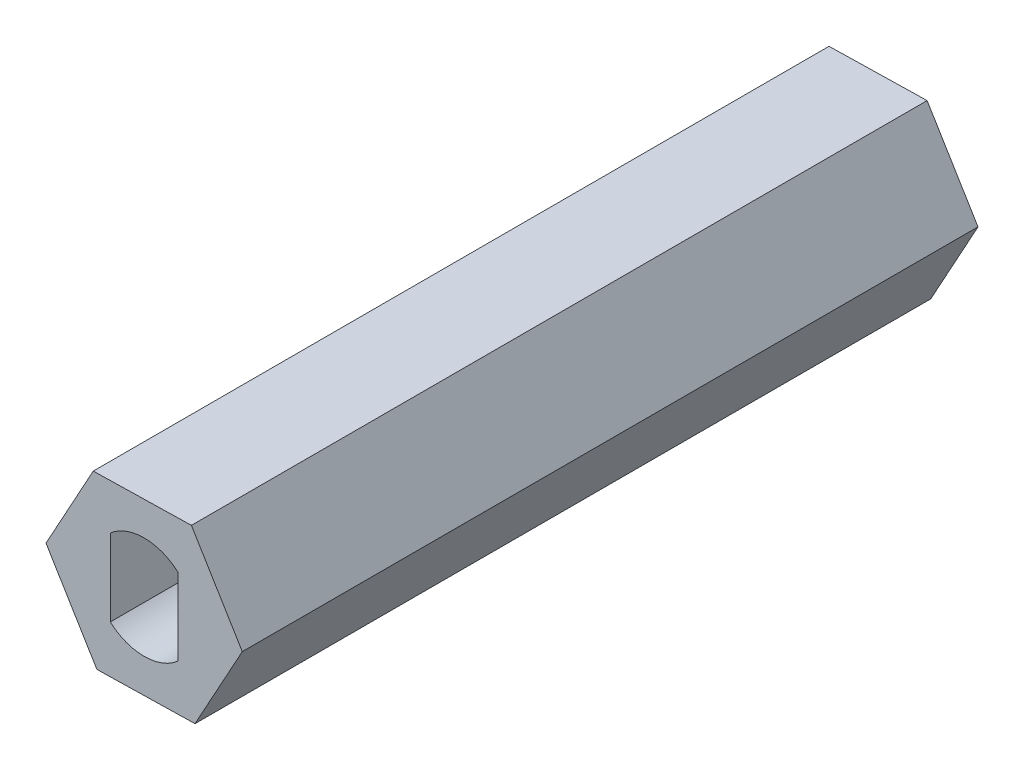
ISO-10303-21;
HEADER;
FILE_DESCRIPTION(('STEP AP214'),'2;1');
FILE_NAME('part.step','',(''),(''),'','','');
FILE_SCHEMA(('AUTOMOTIVE_DESIGN { 1 0 10303 214 1 1 1 1 }'));
ENDSEC;
DATA;
#1=APPLICATION_CONTEXT('core data for automotive mechanical design processes');
#2=APPLICATION_PROTOCOL_DEFINITION('international standard','automotive_design',2000,#1);
#3=PRODUCT_CONTEXT('',#1,'mechanical');
#4=PRODUCT('Part','Part','',(#3));
#5=PRODUCT_RELATED_PRODUCT_CATEGORY('part','',(#4));
#6=PRODUCT_DEFINITION_FORMATION('','',#4);
#7=PRODUCT_DEFINITION_CONTEXT('part definition',#1,'design');
#8=PRODUCT_DEFINITION('design','',#6,#7);
#9=PRODUCT_DEFINITION_SHAPE('','',#8);
#10=(LENGTH_UNIT() NAMED_UNIT(*) SI_UNIT(.MILLI.,.METRE.));
#11=(NAMED_UNIT(*) PLANE_ANGLE_UNIT() SI_UNIT($,.RADIAN.));
#12=(NAMED_UNIT(*) SI_UNIT($,.STERADIAN.) SOLID_ANGLE_UNIT());
#13=UNCERTAINTY_MEASURE_WITH_UNIT(LENGTH_MEASURE(1.E-05),#10,'distance_accuracy_value','');
#14=(GEOMETRIC_REPRESENTATION_CONTEXT(3) GLOBAL_UNCERTAINTY_ASSIGNED_CONTEXT((#13)) GLOBAL_UNIT_ASSIGNED_CONTEXT((#10,
#11,#12)) REPRESENTATION_CONTEXT('',''));
#15=CARTESIAN_POINT('',(0.,0.,0.));
#16=DIRECTION('',(0.,0.,1.));
#17=DIRECTION('',(1.,0.,0.));
#18=AXIS2_PLACEMENT_3D('',#15,#16,#17);
#19=CARTESIAN_POINT('',(0.,0.,8.));
#20=DIRECTION('',(0.,0.,1.));
#21=DIRECTION('',(1.,0.,0.));
#22=AXIS2_PLACEMENT_3D('',#19,#20,#21);
#23=PLANE('',#22);
#24=DIRECTION('',(-0.518226769457367,0.855243249267588,0.));
#25=VECTOR('',#24,1.);
#26=CARTESIAN_POINT('',(5.06886312859848,0.107361927771756,8.));
#27=LINE('',#26,#25);
#28=CARTESIAN_POINT('',(5.06886312859848,0.107361927771756,8.));
#29=VERTEX_POINT('',#28);
#30=CARTESIAN_POINT('',(2.44145340744963,4.44344520155843,8.));
#31=VERTEX_POINT('',#30);
#32=EDGE_CURVE('E202',#29,#31,#27,.T.);
#33=ORIENTED_EDGE('',*,*,#32,.T.);
#34=DIRECTION('',(-0.999775765009561,-0.021175922637427,0.));
#35=VECTOR('',#34,1.);
#36=CARTESIAN_POINT('',(2.44145340744963,4.44344520155843,8.));
#37=LINE('',#36,#35);
#38=CARTESIAN_POINT('',(-2.62740972114885,4.33608327378667,8.));
#39=VERTEX_POINT('',#38);
#40=EDGE_CURVE('E205',#31,#39,#37,.T.);
#41=ORIENTED_EDGE('',*,*,#40,.T.);
#42=DIRECTION('',(-0.481548995552195,-0.876419171905015,0.));
#43=VECTOR('',#42,1.);
#44=CARTESIAN_POINT('',(-2.62740972114885,4.33608327378667,8.));
#45=LINE('',#44,#43);
#46=CARTESIAN_POINT('',(-5.06886312859847,-0.107361927771757,8.));
#47=VERTEX_POINT('',#46);
#48=EDGE_CURVE('E129',#39,#47,#45,.T.);
#49=ORIENTED_EDGE('',*,*,#48,.T.);
#50=DIRECTION('',(0.518226769457367,-0.855243249267588,0.));
#51=VECTOR('',#50,1.);
#52=CARTESIAN_POINT('',(-5.06886312859847,-0.107361927771757,8.));
#53=LINE('',#52,#51);
#54=CARTESIAN_POINT('',(-2.44145340744963,-4.44344520155843,8.));
#55=VERTEX_POINT('',#54);
#56=EDGE_CURVE('E210',#47,#55,#53,.T.);
#57=ORIENTED_EDGE('',*,*,#56,.T.);
#58=DIRECTION('',(0.999775765009561,0.0211759226374271,0.));
#59=VECTOR('',#58,1.);
#60=CARTESIAN_POINT('',(-2.44145340744963,-4.44344520155843,8.));
#61=LINE('',#60,#59);
#62=CARTESIAN_POINT('',(2.62740972114885,-4.33608327378667,8.));
#63=VERTEX_POINT('',#62);
#64=EDGE_CURVE('E213',#55,#63,#61,.T.);
#65=ORIENTED_EDGE('',*,*,#64,.T.);
#66=DIRECTION('',(0.481548995552195,0.876419171905015,0.));
#67=VECTOR('',#66,1.);
#68=CARTESIAN_POINT('',(2.62740972114885,-4.33608327378667,8.));
#69=LINE('',#68,#67);
#70=EDGE_CURVE('E69',#63,#29,#69,.T.);
#71=ORIENTED_EDGE('',*,*,#70,.T.);
#72=EDGE_LOOP('',(#33,#41,#49,#57,#65,#71));
#73=FACE_BOUND('',#72,.T.);
#74=DIRECTION('',(0.,-1.,0.));
#75=VECTOR('',#74,1.);
#76=CARTESIAN_POINT('',(-1.75,2.00477040475577,8.));
#77=LINE('',#76,#75);
#78=CARTESIAN_POINT('',(-1.75,2.00477040475577,8.));
#79=VERTEX_POINT('',#78);
#80=CARTESIAN_POINT('',(-1.75,-1.97522959524423,8.));
#81=VERTEX_POINT('',#80);
#82=EDGE_CURVE('E166',#79,#81,#77,.T.);
#83=ORIENTED_EDGE('',*,*,#82,.F.);
#84=CARTESIAN_POINT('',(0.,0.,8.));
#85=DIRECTION('',(0.,0.,1.));
#86=DIRECTION('',(1.,0.,0.));
#87=AXIS2_PLACEMENT_3D('',#84,#85,#86);
#88=CIRCLE('',#87,2.66112840272404);
#89=CARTESIAN_POINT('',(1.75,2.00477040475577,8.));
#90=VERTEX_POINT('',#89);
#91=EDGE_CURVE('E163',#90,#79,#88,.T.);
#92=ORIENTED_EDGE('',*,*,#91,.F.);
#93=DIRECTION('',(0.,1.,0.));
#94=VECTOR('',#93,1.);
#95=CARTESIAN_POINT('',(1.75,2.00477040475577,8.));
#96=LINE('',#95,#94);
#97=CARTESIAN_POINT('',(1.75,-1.97522959524423,8.));
#98=VERTEX_POINT('',#97);
#99=EDGE_CURVE('E173',#98,#90,#96,.T.);
#100=ORIENTED_EDGE('',*,*,#99,.F.);
#101=CARTESIAN_POINT('',(0.,0.,8.));
#102=DIRECTION('',(0.,0.,1.));
#103=DIRECTION('',(-1.,0.,0.));
#104=AXIS2_PLACEMENT_3D('',#101,#102,#103);
#105=CIRCLE('',#104,2.63894523511359);
#106=EDGE_CURVE('E170',#81,#98,#105,.T.);
#107=ORIENTED_EDGE('',*,*,#106,.F.);
#108=EDGE_LOOP('',(#83,#92,#100,#107));
#109=FACE_BOUND('',#108,.T.);
#110=ADVANCED_FACE('F45',(#73,#109),#23,.T.);
#111=CARTESIAN_POINT('',(5.06886312859848,0.107361927771756,8.));
#112=DIRECTION('',(-0.855243249267588,-0.518226769457367,0.));
#113=DIRECTION('',(0.518226769457367,-0.855243249267588,0.));
#114=AXIS2_PLACEMENT_3D('',#111,#112,#113);
#115=PLANE('',#114);
#116=DIRECTION('',(0.,0.,-1.));
#117=VECTOR('',#116,1.);
#118=CARTESIAN_POINT('',(5.06886312859848,0.107361927771756,8.));
#119=LINE('',#118,#117);
#120=CARTESIAN_POINT('',(5.06886312859848,0.107361927771699,-30.));
#121=VERTEX_POINT('',#120);
#122=EDGE_CURVE('E218',#29,#121,#119,.T.);
#123=ORIENTED_EDGE('',*,*,#122,.T.);
#124=DIRECTION('',(0.518226769457357,-0.855243249267594,0.));
#125=VECTOR('',#124,1.);
#126=CARTESIAN_POINT('',(2.44145340744967,4.4434452015584,-30.));
#127=LINE('',#126,#125);
#128=CARTESIAN_POINT('',(2.44145340744967,4.4434452015584,-30.));
#129=VERTEX_POINT('',#128);
#130=EDGE_CURVE('E141',#129,#121,#127,.T.);
#131=ORIENTED_EDGE('',*,*,#130,.F.);
#132=DIRECTION('',(0.,0.,-1.));
#133=VECTOR('',#132,1.);
#134=CARTESIAN_POINT('',(2.44145340744963,4.44344520155843,8.));
#135=LINE('',#134,#133);
#136=EDGE_CURVE('E11',#31,#129,#135,.T.);
#137=ORIENTED_EDGE('',*,*,#136,.F.);
#138=ORIENTED_EDGE('',*,*,#32,.F.);
#139=EDGE_LOOP('',(#123,#131,#137,#138));
#140=FACE_BOUND('',#139,.T.);
#141=ADVANCED_FACE('F47',(#140),#115,.F.);
#142=CARTESIAN_POINT('',(2.44145340744963,4.44344520155843,8.));
#143=DIRECTION('',(0.021175922637427,-0.999775765009561,0.));
#144=DIRECTION('',(0.999775765009561,0.021175922637427,0.));
#145=AXIS2_PLACEMENT_3D('',#142,#143,#144);
#146=PLANE('',#145);
#147=ORIENTED_EDGE('',*,*,#136,.T.);
#148=DIRECTION('',(0.999775765009562,0.0211759226374165,0.));
#149=VECTOR('',#148,1.);
#150=CARTESIAN_POINT('',(-2.6274097211488,4.3360832737867,-30.));
#151=LINE('',#150,#149);
#152=CARTESIAN_POINT('',(-2.6274097211488,4.3360832737867,-30.));
#153=VERTEX_POINT('',#152);
#154=EDGE_CURVE('E134',#153,#129,#151,.T.);
#155=ORIENTED_EDGE('',*,*,#154,.F.);
#156=DIRECTION('',(0.,0.,-1.));
#157=VECTOR('',#156,1.);
#158=CARTESIAN_POINT('',(-2.62740972114885,4.33608327378667,8.));
#159=LINE('',#158,#157);
#160=EDGE_CURVE('E54',#39,#153,#159,.T.);
#161=ORIENTED_EDGE('',*,*,#160,.F.);
#162=ORIENTED_EDGE('',*,*,#40,.F.);
#163=EDGE_LOOP('',(#147,#155,#161,#162));
#164=FACE_BOUND('',#163,.T.);
#165=ADVANCED_FACE('F135',(#164),#146,.F.);
#166=CARTESIAN_POINT('',(-2.62740972114885,4.33608327378667,8.));
#167=DIRECTION('',(0.876419171905015,-0.481548995552195,0.));
#168=DIRECTION('',(0.481548995552195,0.876419171905015,0.));
#169=AXIS2_PLACEMENT_3D('',#166,#167,#168);
#170=PLANE('',#169);
#171=ORIENTED_EDGE('',*,*,#160,.T.);
#172=DIRECTION('',(0.481548995552204,0.87641917190501,0.));
#173=VECTOR('',#172,1.);
#174=CARTESIAN_POINT('',(-5.06886312859848,-0.107361927771699,-30.));
#175=LINE('',#174,#173);
#176=CARTESIAN_POINT('',(-5.06886312859848,-0.107361927771699,-30.));
#177=VERTEX_POINT('',#176);
#178=EDGE_CURVE('E128',#177,#153,#175,.T.);
#179=ORIENTED_EDGE('',*,*,#178,.F.);
#180=DIRECTION('',(0.,0.,-1.));
#181=VECTOR('',#180,1.);
#182=CARTESIAN_POINT('',(-5.06886312859847,-0.107361927771757,8.));
#183=LINE('',#182,#181);
#184=EDGE_CURVE('E132',#47,#177,#183,.T.);
#185=ORIENTED_EDGE('',*,*,#184,.F.);
#186=ORIENTED_EDGE('',*,*,#48,.F.);
#187=EDGE_LOOP('',(#171,#179,#185,#186));
#188=FACE_BOUND('',#187,.T.);
#189=ADVANCED_FACE('F125',(#188),#170,.F.);
#190=CARTESIAN_POINT('',(-5.06886312859847,-0.107361927771757,8.));
#191=DIRECTION('',(0.855243249267588,0.518226769457367,0.));
#192=DIRECTION('',(-0.518226769457367,0.855243249267588,0.));
#193=AXIS2_PLACEMENT_3D('',#190,#191,#192);
#194=PLANE('',#193);
#195=ORIENTED_EDGE('',*,*,#184,.T.);
#196=DIRECTION('',(-0.518226769457357,0.855243249267593,0.));
#197=VECTOR('',#196,1.);
#198=CARTESIAN_POINT('',(-2.44145340744968,-4.4434452015584,-30.));
#199=LINE('',#198,#197);
#200=CARTESIAN_POINT('',(-2.44145340744968,-4.4434452015584,-30.));
#201=VERTEX_POINT('',#200);
#202=EDGE_CURVE('E147',#201,#177,#199,.T.);
#203=ORIENTED_EDGE('',*,*,#202,.F.);
#204=DIRECTION('',(0.,0.,-1.));
#205=VECTOR('',#204,1.);
#206=CARTESIAN_POINT('',(-2.44145340744963,-4.44344520155843,8.));
#207=LINE('',#206,#205);
#208=EDGE_CURVE('E224',#55,#201,#207,.T.);
#209=ORIENTED_EDGE('',*,*,#208,.F.);
#210=ORIENTED_EDGE('',*,*,#56,.F.);
#211=EDGE_LOOP('',(#195,#203,#209,#210));
#212=FACE_BOUND('',#211,.T.);
#213=ADVANCED_FACE('F230',(#212),#194,.F.);
#214=CARTESIAN_POINT('',(-2.44145340744963,-4.44344520155843,8.));
#215=DIRECTION('',(-0.0211759226374271,0.999775765009561,0.));
#216=DIRECTION('',(-0.999775765009561,-0.0211759226374271,0.));
#217=AXIS2_PLACEMENT_3D('',#214,#215,#216);
#218=PLANE('',#217);
#219=ORIENTED_EDGE('',*,*,#208,.T.);
#220=DIRECTION('',(-0.999775765009562,-0.0211759226374165,0.));
#221=VECTOR('',#220,1.);
#222=CARTESIAN_POINT('',(2.6274097211488,-4.3360832737867,-30.));
#223=LINE('',#222,#221);
#224=CARTESIAN_POINT('',(2.6274097211488,-4.3360832737867,-30.));
#225=VERTEX_POINT('',#224);
#226=EDGE_CURVE('E157',#225,#201,#223,.T.);
#227=ORIENTED_EDGE('',*,*,#226,.F.);
#228=DIRECTION('',(0.,0.,-1.));
#229=VECTOR('',#228,1.);
#230=CARTESIAN_POINT('',(2.62740972114885,-4.33608327378667,8.));
#231=LINE('',#230,#229);
#232=EDGE_CURVE('E221',#63,#225,#231,.T.);
#233=ORIENTED_EDGE('',*,*,#232,.F.);
#234=ORIENTED_EDGE('',*,*,#64,.F.);
#235=EDGE_LOOP('',(#219,#227,#233,#234));
#236=FACE_BOUND('',#235,.T.);
#237=ADVANCED_FACE('F242',(#236),#218,.F.);
#238=CARTESIAN_POINT('',(2.62740972114885,-4.33608327378667,8.));
#239=DIRECTION('',(-0.876419171905015,0.481548995552195,0.));
#240=DIRECTION('',(-0.481548995552195,-0.876419171905015,0.));
#241=AXIS2_PLACEMENT_3D('',#238,#239,#240);
#242=PLANE('',#241);
#243=ORIENTED_EDGE('',*,*,#232,.T.);
#244=DIRECTION('',(-0.481548995552204,-0.87641917190501,0.));
#245=VECTOR('',#244,1.);
#246=CARTESIAN_POINT('',(5.06886312859848,0.107361927771699,-30.));
#247=LINE('',#246,#245);
#248=EDGE_CURVE('E153',#121,#225,#247,.T.);
#249=ORIENTED_EDGE('',*,*,#248,.F.);
#250=ORIENTED_EDGE('',*,*,#122,.F.);
#251=ORIENTED_EDGE('',*,*,#70,.F.);
#252=EDGE_LOOP('',(#243,#249,#250,#251));
#253=FACE_BOUND('',#252,.T.);
#254=ADVANCED_FACE('F240',(#253),#242,.F.);
#255=CARTESIAN_POINT('',(0.,0.,8.));
#256=DIRECTION('',(0.,0.,-1.));
#257=DIRECTION('',(-1.,0.,0.));
#258=AXIS2_PLACEMENT_3D('',#255,#256,#257);
#259=CYLINDRICAL_SURFACE('',#258,2.66112840272404);
#260=CARTESIAN_POINT('',(0.,0.,0.));
#261=DIRECTION('',(0.,0.,1.));
#262=DIRECTION('',(1.,0.,0.));
#263=AXIS2_PLACEMENT_3D('',#260,#261,#262);
#264=CIRCLE('',#263,2.66112840272404);
#265=CARTESIAN_POINT('',(1.75,2.00477040475577,0.));
#266=VERTEX_POINT('',#265);
#267=CARTESIAN_POINT('',(-1.75,2.00477040475577,0.));
#268=VERTEX_POINT('',#267);
#269=EDGE_CURVE('E162',#266,#268,#264,.T.);
#270=ORIENTED_EDGE('',*,*,#269,.F.);
#271=DIRECTION('',(0.,0.,-1.));
#272=VECTOR('',#271,1.);
#273=CARTESIAN_POINT('',(1.75,2.00477040475577,8.));
#274=LINE('',#273,#272);
#275=EDGE_CURVE('E176',#90,#266,#274,.T.);
#276=ORIENTED_EDGE('',*,*,#275,.F.);
#277=ORIENTED_EDGE('',*,*,#91,.T.);
#278=DIRECTION('',(0.,0.,-1.));
#279=VECTOR('',#278,1.);
#280=CARTESIAN_POINT('',(-1.75,2.00477040475577,8.));
#281=LINE('',#280,#279);
#282=EDGE_CURVE('E198',#79,#268,#281,.T.);
#283=ORIENTED_EDGE('',*,*,#282,.T.);
#284=EDGE_LOOP('',(#270,#276,#277,#283));
#285=FACE_BOUND('',#284,.T.);
#286=ADVANCED_FACE('F249',(#285),#259,.F.);
#287=CARTESIAN_POINT('',(-1.75,2.00477040475577,8.));
#288=DIRECTION('',(1.,0.,0.));
#289=DIRECTION('',(0.,1.,0.));
#290=AXIS2_PLACEMENT_3D('',#287,#288,#289);
#291=PLANE('',#290);
#292=DIRECTION('',(0.,-1.,0.));
#293=VECTOR('',#292,1.);
#294=CARTESIAN_POINT('',(-1.75,2.00477040475577,0.));
#295=LINE('',#294,#293);
#296=CARTESIAN_POINT('',(-1.75,-1.97522959524423,0.));
#297=VERTEX_POINT('',#296);
#298=EDGE_CURVE('E180',#268,#297,#295,.T.);
#299=ORIENTED_EDGE('',*,*,#298,.F.);
#300=ORIENTED_EDGE('',*,*,#282,.F.);
#301=ORIENTED_EDGE('',*,*,#82,.T.);
#302=DIRECTION('',(0.,0.,-1.));
#303=VECTOR('',#302,1.);
#304=CARTESIAN_POINT('',(-1.75,-1.97522959524423,8.));
#305=LINE('',#304,#303);
#306=EDGE_CURVE('E195',#81,#297,#305,.T.);
#307=ORIENTED_EDGE('',*,*,#306,.T.);
#308=EDGE_LOOP('',(#299,#300,#301,#307));
#309=FACE_BOUND('',#308,.T.);
#310=ADVANCED_FACE('F260',(#309),#291,.T.);
#311=CARTESIAN_POINT('',(0.,0.,8.));
#312=DIRECTION('',(0.,0.,-1.));
#313=DIRECTION('',(-1.,0.,0.));
#314=AXIS2_PLACEMENT_3D('',#311,#312,#313);
#315=CYLINDRICAL_SURFACE('',#314,2.63894523511359);
#316=CARTESIAN_POINT('',(0.,0.,0.));
#317=DIRECTION('',(0.,0.,1.));
#318=DIRECTION('',(-1.,0.,0.));
#319=AXIS2_PLACEMENT_3D('',#316,#317,#318);
#320=CIRCLE('',#319,2.63894523511359);
#321=CARTESIAN_POINT('',(1.75,-1.97522959524423,0.));
#322=VERTEX_POINT('',#321);
#323=EDGE_CURVE('E184',#297,#322,#320,.T.);
#324=ORIENTED_EDGE('',*,*,#323,.F.);
#325=ORIENTED_EDGE('',*,*,#306,.F.);
#326=ORIENTED_EDGE('',*,*,#106,.T.);
#327=DIRECTION('',(0.,0.,-1.));
#328=VECTOR('',#327,1.);
#329=CARTESIAN_POINT('',(1.75,-1.97522959524423,8.));
#330=LINE('',#329,#328);
#331=EDGE_CURVE('E61',#98,#322,#330,.T.);
#332=ORIENTED_EDGE('',*,*,#331,.T.);
#333=EDGE_LOOP('',(#324,#325,#326,#332));
#334=FACE_BOUND('',#333,.T.);
#335=ADVANCED_FACE('F264',(#334),#315,.F.);
#336=CARTESIAN_POINT('',(1.75,2.00477040475577,8.));
#337=DIRECTION('',(-1.,0.,0.));
#338=DIRECTION('',(0.,-1.,0.));
#339=AXIS2_PLACEMENT_3D('',#336,#337,#338);
#340=PLANE('',#339);
#341=DIRECTION('',(0.,1.,0.));
#342=VECTOR('',#341,1.);
#343=CARTESIAN_POINT('',(1.75,2.00477040475577,0.));
#344=LINE('',#343,#342);
#345=EDGE_CURVE('E167',#322,#266,#344,.T.);
#346=ORIENTED_EDGE('',*,*,#345,.F.);
#347=ORIENTED_EDGE('',*,*,#331,.F.);
#348=ORIENTED_EDGE('',*,*,#99,.T.);
#349=ORIENTED_EDGE('',*,*,#275,.T.);
#350=EDGE_LOOP('',(#346,#347,#348,#349));
#351=FACE_BOUND('',#350,.T.);
#352=ADVANCED_FACE('F268',(#351),#340,.T.);
#353=CARTESIAN_POINT('',(0.,0.,0.));
#354=DIRECTION('',(0.,0.,-1.));
#355=DIRECTION('',(-1.,0.,0.));
#356=AXIS2_PLACEMENT_3D('',#353,#354,#355);
#357=PLANE('',#356);
#358=ORIENTED_EDGE('',*,*,#345,.T.);
#359=ORIENTED_EDGE('',*,*,#269,.T.);
#360=ORIENTED_EDGE('',*,*,#298,.T.);
#361=ORIENTED_EDGE('',*,*,#323,.T.);
#362=EDGE_LOOP('',(#358,#359,#360,#361));
#363=FACE_BOUND('',#362,.T.);
#364=ADVANCED_FACE('F272',(#363),#357,.F.);
#365=CARTESIAN_POINT('',(0.,0.,-30.));
#366=DIRECTION('',(0.,0.,-1.));
#367=DIRECTION('',(-1.,0.,0.));
#368=AXIS2_PLACEMENT_3D('',#365,#366,#367);
#369=PLANE('',#368);
#370=ORIENTED_EDGE('',*,*,#178,.T.);
#371=ORIENTED_EDGE('',*,*,#154,.T.);
#372=ORIENTED_EDGE('',*,*,#130,.T.);
#373=ORIENTED_EDGE('',*,*,#248,.T.);
#374=ORIENTED_EDGE('',*,*,#226,.T.);
#375=ORIENTED_EDGE('',*,*,#202,.T.);
#376=EDGE_LOOP('',(#370,#371,#372,#373,#374,#375));
#377=FACE_BOUND('',#376,.T.);
#378=ADVANCED_FACE('F144',(#377),#369,.T.);
#379=CLOSED_SHELL('',(#110,#141,#165,#189,#213,#237,#254,#286,#310,#335,#352,#364,#378));
#380=MANIFOLD_SOLID_BREP('B2',#379);
#381=ADVANCED_BREP_SHAPE_REPRESENTATION('',(#18,#380),#14);
#382=SHAPE_DEFINITION_REPRESENTATION(#9,#381);
ENDSEC;
END-ISO-10303-21;
